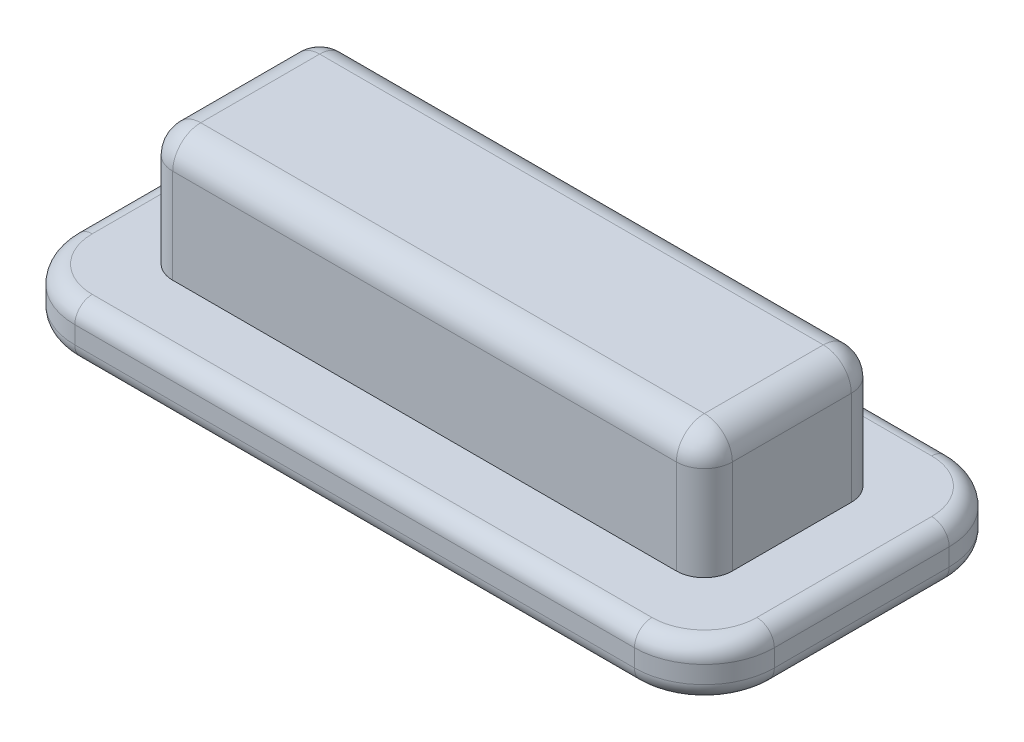
ISO-10303-21;
HEADER;
FILE_DESCRIPTION(('STEP AP214'),'2;1');
FILE_NAME('part.step','',(''),(''),'','','');
FILE_SCHEMA(('AUTOMOTIVE_DESIGN { 1 0 10303 214 1 1 1 1 }'));
ENDSEC;
DATA;
#1=APPLICATION_CONTEXT('core data for automotive mechanical design processes');
#2=APPLICATION_PROTOCOL_DEFINITION('international standard','automotive_design',2000,#1);
#3=PRODUCT_CONTEXT('',#1,'mechanical');
#4=PRODUCT('Part','Part','',(#3));
#5=PRODUCT_RELATED_PRODUCT_CATEGORY('part','',(#4));
#6=PRODUCT_DEFINITION_FORMATION('','',#4);
#7=PRODUCT_DEFINITION_CONTEXT('part definition',#1,'design');
#8=PRODUCT_DEFINITION('design','',#6,#7);
#9=PRODUCT_DEFINITION_SHAPE('','',#8);
#10=(LENGTH_UNIT() NAMED_UNIT(*) SI_UNIT(.MILLI.,.METRE.));
#11=(NAMED_UNIT(*) PLANE_ANGLE_UNIT() SI_UNIT($,.RADIAN.));
#12=(NAMED_UNIT(*) SI_UNIT($,.STERADIAN.) SOLID_ANGLE_UNIT());
#13=UNCERTAINTY_MEASURE_WITH_UNIT(LENGTH_MEASURE(1.E-05),#10,'distance_accuracy_value','');
#14=(GEOMETRIC_REPRESENTATION_CONTEXT(3) GLOBAL_UNCERTAINTY_ASSIGNED_CONTEXT((#13)) GLOBAL_UNIT_ASSIGNED_CONTEXT((#10,
#11,#12)) REPRESENTATION_CONTEXT('',''));
#15=CARTESIAN_POINT('',(0.,0.,0.));
#16=DIRECTION('',(0.,0.,1.));
#17=DIRECTION('',(1.,0.,0.));
#18=AXIS2_PLACEMENT_3D('',#15,#16,#17);
#19=CARTESIAN_POINT('',(0.,1.75,-2.5));
#20=DIRECTION('',(0.,0.,-1.));
#21=DIRECTION('',(-1.,0.,0.));
#22=AXIS2_PLACEMENT_3D('',#19,#20,#21);
#23=PLANE('',#22);
#24=DIRECTION('',(0.,-1.,0.));
#25=VECTOR('',#24,1.);
#26=CARTESIAN_POINT('',(0.4,1.75,-2.5));
#27=LINE('',#26,#25);
#28=CARTESIAN_POINT('',(0.4,0.,-2.5));
#29=VERTEX_POINT('',#28);
#30=CARTESIAN_POINT('',(0.4,1.35,-2.5));
#31=VERTEX_POINT('',#30);
#32=EDGE_CURVE('E257',#29,#31,#27,.F.);
#33=ORIENTED_EDGE('',*,*,#32,.T.);
#34=DIRECTION('',(1.,0.,0.));
#35=VECTOR('',#34,1.);
#36=CARTESIAN_POINT('',(0.,1.35,-2.5));
#37=LINE('',#36,#35);
#38=CARTESIAN_POINT('',(7.6,1.35,-2.5));
#39=VERTEX_POINT('',#38);
#40=EDGE_CURVE('E289',#31,#39,#37,.T.);
#41=ORIENTED_EDGE('',*,*,#40,.T.);
#42=DIRECTION('',(0.,-1.,0.));
#43=VECTOR('',#42,1.);
#44=CARTESIAN_POINT('',(7.6,0.,-2.5));
#45=LINE('',#44,#43);
#46=CARTESIAN_POINT('',(7.6,0.,-2.5));
#47=VERTEX_POINT('',#46);
#48=EDGE_CURVE('E263',#39,#47,#45,.T.);
#49=ORIENTED_EDGE('',*,*,#48,.T.);
#50=DIRECTION('',(1.,0.,0.));
#51=VECTOR('',#50,1.);
#52=CARTESIAN_POINT('',(0.,0.,-2.5));
#53=LINE('',#52,#51);
#54=EDGE_CURVE('E246',#29,#47,#53,.T.);
#55=ORIENTED_EDGE('',*,*,#54,.F.);
#56=EDGE_LOOP('',(#33,#41,#49,#55));
#57=FACE_BOUND('',#56,.T.);
#58=ADVANCED_FACE('F43',(#57),#23,.T.);
#59=CARTESIAN_POINT('',(0.,1.75,0.));
#60=DIRECTION('',(-1.,0.,0.));
#61=DIRECTION('',(0.,0.,1.));
#62=AXIS2_PLACEMENT_3D('',#59,#60,#61);
#63=PLANE('',#62);
#64=DIRECTION('',(0.,-1.,0.));
#65=VECTOR('',#64,1.);
#66=CARTESIAN_POINT('',(0.,1.75,-0.4));
#67=LINE('',#66,#65);
#68=CARTESIAN_POINT('',(0.,0.,-0.4));
#69=VERTEX_POINT('',#68);
#70=CARTESIAN_POINT('',(0.,1.35,-0.4));
#71=VERTEX_POINT('',#70);
#72=EDGE_CURVE('E264',#69,#71,#67,.F.);
#73=ORIENTED_EDGE('',*,*,#72,.T.);
#74=DIRECTION('',(0.,0.,-1.));
#75=VECTOR('',#74,1.);
#76=CARTESIAN_POINT('',(0.,1.35,0.));
#77=LINE('',#76,#75);
#78=CARTESIAN_POINT('',(0.,1.35,-2.1));
#79=VERTEX_POINT('',#78);
#80=EDGE_CURVE('E280',#71,#79,#77,.T.);
#81=ORIENTED_EDGE('',*,*,#80,.T.);
#82=DIRECTION('',(0.,-1.,0.));
#83=VECTOR('',#82,1.);
#84=CARTESIAN_POINT('',(0.,1.75,-2.1));
#85=LINE('',#84,#83);
#86=CARTESIAN_POINT('',(0.,0.,-2.1));
#87=VERTEX_POINT('',#86);
#88=EDGE_CURVE('E245',#79,#87,#85,.T.);
#89=ORIENTED_EDGE('',*,*,#88,.T.);
#90=DIRECTION('',(0.,0.,-1.));
#91=VECTOR('',#90,1.);
#92=CARTESIAN_POINT('',(0.,0.,0.));
#93=LINE('',#92,#91);
#94=EDGE_CURVE('E249',#69,#87,#93,.T.);
#95=ORIENTED_EDGE('',*,*,#94,.F.);
#96=EDGE_LOOP('',(#73,#81,#89,#95));
#97=FACE_BOUND('',#96,.T.);
#98=ADVANCED_FACE('F554',(#97),#63,.T.);
#99=CARTESIAN_POINT('',(0.,1.75,0.));
#100=DIRECTION('',(0.,0.,-1.));
#101=DIRECTION('',(-1.,0.,0.));
#102=AXIS2_PLACEMENT_3D('',#99,#100,#101);
#103=PLANE('',#102);
#104=DIRECTION('',(0.,-1.,0.));
#105=VECTOR('',#104,1.);
#106=CARTESIAN_POINT('',(7.6,1.75,0.));
#107=LINE('',#106,#105);
#108=CARTESIAN_POINT('',(7.6,0.,0.));
#109=VERTEX_POINT('',#108);
#110=CARTESIAN_POINT('',(7.6,1.35,0.));
#111=VERTEX_POINT('',#110);
#112=EDGE_CURVE('E240',#109,#111,#107,.F.);
#113=ORIENTED_EDGE('',*,*,#112,.T.);
#114=DIRECTION('',(1.,0.,0.));
#115=VECTOR('',#114,1.);
#116=CARTESIAN_POINT('',(0.4,1.35,0.));
#117=LINE('',#116,#115);
#118=CARTESIAN_POINT('',(0.4,1.35,0.));
#119=VERTEX_POINT('',#118);
#120=EDGE_CURVE('E300',#111,#119,#117,.F.);
#121=ORIENTED_EDGE('',*,*,#120,.T.);
#122=DIRECTION('',(0.,-1.,0.));
#123=VECTOR('',#122,1.);
#124=CARTESIAN_POINT('',(0.4,0.,0.));
#125=LINE('',#124,#123);
#126=CARTESIAN_POINT('',(0.4,0.,0.));
#127=VERTEX_POINT('',#126);
#128=EDGE_CURVE('E229',#119,#127,#125,.T.);
#129=ORIENTED_EDGE('',*,*,#128,.T.);
#130=DIRECTION('',(1.,0.,0.));
#131=VECTOR('',#130,1.);
#132=CARTESIAN_POINT('',(0.,0.,0.));
#133=LINE('',#132,#131);
#134=EDGE_CURVE('E250',#127,#109,#133,.T.);
#135=ORIENTED_EDGE('',*,*,#134,.T.);
#136=EDGE_LOOP('',(#113,#121,#129,#135));
#137=FACE_BOUND('',#136,.T.);
#138=ADVANCED_FACE('F558',(#137),#103,.F.);
#139=CARTESIAN_POINT('',(8.,1.75,0.));
#140=DIRECTION('',(-1.,0.,0.));
#141=DIRECTION('',(0.,0.,1.));
#142=AXIS2_PLACEMENT_3D('',#139,#140,#141);
#143=PLANE('',#142);
#144=DIRECTION('',(0.,-1.,0.));
#145=VECTOR('',#144,1.);
#146=CARTESIAN_POINT('',(8.,1.75,-2.1));
#147=LINE('',#146,#145);
#148=CARTESIAN_POINT('',(8.,0.,-2.1));
#149=VERTEX_POINT('',#148);
#150=CARTESIAN_POINT('',(8.,1.35,-2.1));
#151=VERTEX_POINT('',#150);
#152=EDGE_CURVE('E233',#149,#151,#147,.F.);
#153=ORIENTED_EDGE('',*,*,#152,.T.);
#154=DIRECTION('',(0.,0.,-1.));
#155=VECTOR('',#154,1.);
#156=CARTESIAN_POINT('',(8.,1.35,-0.4));
#157=LINE('',#156,#155);
#158=CARTESIAN_POINT('',(8.,1.35,-0.4));
#159=VERTEX_POINT('',#158);
#160=EDGE_CURVE('E230',#151,#159,#157,.F.);
#161=ORIENTED_EDGE('',*,*,#160,.T.);
#162=DIRECTION('',(0.,-1.,0.));
#163=VECTOR('',#162,1.);
#164=CARTESIAN_POINT('',(8.,1.75,-0.4));
#165=LINE('',#164,#163);
#166=CARTESIAN_POINT('',(8.,0.,-0.4));
#167=VERTEX_POINT('',#166);
#168=EDGE_CURVE('E218',#159,#167,#165,.T.);
#169=ORIENTED_EDGE('',*,*,#168,.T.);
#170=DIRECTION('',(0.,0.,-1.));
#171=VECTOR('',#170,1.);
#172=CARTESIAN_POINT('',(8.,0.,0.));
#173=LINE('',#172,#171);
#174=EDGE_CURVE('E221',#167,#149,#173,.T.);
#175=ORIENTED_EDGE('',*,*,#174,.T.);
#176=EDGE_LOOP('',(#153,#161,#169,#175));
#177=FACE_BOUND('',#176,.T.);
#178=ADVANCED_FACE('F225',(#177),#143,.F.);
#179=CARTESIAN_POINT('',(0.,1.75,0.));
#180=DIRECTION('',(0.,1.,0.));
#181=DIRECTION('',(0.,0.,1.));
#182=AXIS2_PLACEMENT_3D('',#179,#180,#181);
#183=PLANE('',#182);
#184=DIRECTION('',(1.,0.,0.));
#185=VECTOR('',#184,1.);
#186=CARTESIAN_POINT('',(0.,1.75,-2.1));
#187=LINE('',#186,#185);
#188=CARTESIAN_POINT('',(7.6,1.75,-2.1));
#189=VERTEX_POINT('',#188);
#190=CARTESIAN_POINT('',(0.4,1.75,-2.1));
#191=VERTEX_POINT('',#190);
#192=EDGE_CURVE('E282',#189,#191,#187,.F.);
#193=ORIENTED_EDGE('',*,*,#192,.T.);
#194=DIRECTION('',(0.,0.,-1.));
#195=VECTOR('',#194,1.);
#196=CARTESIAN_POINT('',(0.4,1.75,0.));
#197=LINE('',#196,#195);
#198=CARTESIAN_POINT('',(0.4,1.75,-0.4));
#199=VERTEX_POINT('',#198);
#200=EDGE_CURVE('E284',#191,#199,#197,.F.);
#201=ORIENTED_EDGE('',*,*,#200,.T.);
#202=DIRECTION('',(1.,0.,0.));
#203=VECTOR('',#202,1.);
#204=CARTESIAN_POINT('',(7.6,1.75,-0.4));
#205=LINE('',#204,#203);
#206=CARTESIAN_POINT('',(7.6,1.75,-0.4));
#207=VERTEX_POINT('',#206);
#208=EDGE_CURVE('E276',#199,#207,#205,.T.);
#209=ORIENTED_EDGE('',*,*,#208,.T.);
#210=DIRECTION('',(0.,0.,-1.));
#211=VECTOR('',#210,1.);
#212=CARTESIAN_POINT('',(7.6,1.75,-2.1));
#213=LINE('',#212,#211);
#214=EDGE_CURVE('E281',#207,#189,#213,.T.);
#215=ORIENTED_EDGE('',*,*,#214,.T.);
#216=EDGE_LOOP('',(#193,#201,#209,#215));
#217=FACE_BOUND('',#216,.T.);
#218=ADVANCED_FACE('F854',(#217),#183,.T.);
#219=CARTESIAN_POINT('',(0.,0.,0.));
#220=DIRECTION('',(0.,-1.,0.));
#221=DIRECTION('',(0.,0.,-1.));
#222=AXIS2_PLACEMENT_3D('',#219,#220,#221);
#223=PLANE('',#222);
#224=DIRECTION('',(-1.,0.,0.));
#225=VECTOR('',#224,1.);
#226=CARTESIAN_POINT('',(0.,0.,0.75));
#227=LINE('',#226,#225);
#228=CARTESIAN_POINT('',(0.,0.,0.75));
#229=VERTEX_POINT('',#228);
#230=CARTESIAN_POINT('',(8.,0.,0.75));
#231=VERTEX_POINT('',#230);
#232=EDGE_CURVE('E395',#229,#231,#227,.F.);
#233=ORIENTED_EDGE('',*,*,#232,.T.);
#234=CARTESIAN_POINT('',(8.,0.,0.));
#235=DIRECTION('',(0.,-1.,0.));
#236=DIRECTION('',(0.,0.,-1.));
#237=AXIS2_PLACEMENT_3D('',#234,#235,#236);
#238=CIRCLE('',#237,0.75);
#239=CARTESIAN_POINT('',(8.75,0.,0.));
#240=VERTEX_POINT('',#239);
#241=EDGE_CURVE('E403',#231,#240,#238,.F.);
#242=ORIENTED_EDGE('',*,*,#241,.T.);
#243=DIRECTION('',(0.,0.,1.));
#244=VECTOR('',#243,1.);
#245=CARTESIAN_POINT('',(8.75,0.,0.));
#246=LINE('',#245,#244);
#247=CARTESIAN_POINT('',(8.75,0.,-2.5));
#248=VERTEX_POINT('',#247);
#249=EDGE_CURVE('E70',#240,#248,#246,.F.);
#250=ORIENTED_EDGE('',*,*,#249,.T.);
#251=CARTESIAN_POINT('',(8.,0.,-2.5));
#252=DIRECTION('',(0.,-1.,0.));
#253=DIRECTION('',(0.,0.,-1.));
#254=AXIS2_PLACEMENT_3D('',#251,#252,#253);
#255=CIRCLE('',#254,0.75);
#256=CARTESIAN_POINT('',(8.,0.,-3.25));
#257=VERTEX_POINT('',#256);
#258=EDGE_CURVE('E405',#248,#257,#255,.F.);
#259=ORIENTED_EDGE('',*,*,#258,.T.);
#260=DIRECTION('',(1.,0.,0.));
#261=VECTOR('',#260,1.);
#262=CARTESIAN_POINT('',(0.,0.,-3.25));
#263=LINE('',#262,#261);
#264=CARTESIAN_POINT('',(0.,0.,-3.25));
#265=VERTEX_POINT('',#264);
#266=EDGE_CURVE('E399',#257,#265,#263,.F.);
#267=ORIENTED_EDGE('',*,*,#266,.T.);
#268=CARTESIAN_POINT('',(0.,0.,-2.5));
#269=DIRECTION('',(0.,-1.,0.));
#270=DIRECTION('',(0.,0.,-1.));
#271=AXIS2_PLACEMENT_3D('',#268,#269,#270);
#272=CIRCLE('',#271,0.75);
#273=CARTESIAN_POINT('',(-0.75,0.,-2.5));
#274=VERTEX_POINT('',#273);
#275=EDGE_CURVE('E396',#265,#274,#272,.F.);
#276=ORIENTED_EDGE('',*,*,#275,.T.);
#277=DIRECTION('',(0.,0.,-1.));
#278=VECTOR('',#277,1.);
#279=CARTESIAN_POINT('',(-0.75,0.,0.));
#280=LINE('',#279,#278);
#281=CARTESIAN_POINT('',(-0.75,0.,0.));
#282=VERTEX_POINT('',#281);
#283=EDGE_CURVE('E398',#274,#282,#280,.F.);
#284=ORIENTED_EDGE('',*,*,#283,.T.);
#285=CARTESIAN_POINT('',(0.,0.,0.));
#286=DIRECTION('',(0.,-1.,0.));
#287=DIRECTION('',(0.,0.,-1.));
#288=AXIS2_PLACEMENT_3D('',#285,#286,#287);
#289=CIRCLE('',#288,0.75);
#290=EDGE_CURVE('E393',#282,#229,#289,.F.);
#291=ORIENTED_EDGE('',*,*,#290,.T.);
#292=EDGE_LOOP('',(#233,#242,#250,#259,#267,#276,#284,#291));
#293=FACE_BOUND('',#292,.T.);
#294=ORIENTED_EDGE('',*,*,#134,.F.);
#295=CARTESIAN_POINT('',(0.4,0.,-0.4));
#296=DIRECTION('',(0.,-1.,0.));
#297=DIRECTION('',(0.,0.,-1.));
#298=AXIS2_PLACEMENT_3D('',#295,#296,#297);
#299=CIRCLE('',#298,0.4);
#300=EDGE_CURVE('E275',#127,#69,#299,.T.);
#301=ORIENTED_EDGE('',*,*,#300,.T.);
#302=ORIENTED_EDGE('',*,*,#94,.T.);
#303=CARTESIAN_POINT('',(0.4,0.,-2.1));
#304=DIRECTION('',(0.,-1.,0.));
#305=DIRECTION('',(0.,0.,-1.));
#306=AXIS2_PLACEMENT_3D('',#303,#304,#305);
#307=CIRCLE('',#306,0.4);
#308=EDGE_CURVE('E269',#87,#29,#307,.T.);
#309=ORIENTED_EDGE('',*,*,#308,.T.);
#310=ORIENTED_EDGE('',*,*,#54,.T.);
#311=CARTESIAN_POINT('',(7.6,0.,-2.1));
#312=DIRECTION('',(0.,-1.,0.));
#313=DIRECTION('',(0.,0.,-1.));
#314=AXIS2_PLACEMENT_3D('',#311,#312,#313);
#315=CIRCLE('',#314,0.4);
#316=EDGE_CURVE('E241',#47,#149,#315,.T.);
#317=ORIENTED_EDGE('',*,*,#316,.T.);
#318=ORIENTED_EDGE('',*,*,#174,.F.);
#319=CARTESIAN_POINT('',(7.6,0.,-0.4));
#320=DIRECTION('',(0.,-1.,0.));
#321=DIRECTION('',(0.,0.,-1.));
#322=AXIS2_PLACEMENT_3D('',#319,#320,#321);
#323=CIRCLE('',#322,0.4);
#324=EDGE_CURVE('E232',#167,#109,#323,.T.);
#325=ORIENTED_EDGE('',*,*,#324,.T.);
#326=EDGE_LOOP('',(#294,#301,#302,#309,#310,#317,#318,#325));
#327=FACE_BOUND('',#326,.T.);
#328=ADVANCED_FACE('F243',(#293,#327),#223,.F.);
#329=CARTESIAN_POINT('',(-1.,-0.75,1.));
#330=DIRECTION('',(1.,0.,0.));
#331=DIRECTION('',(0.,0.,-1.));
#332=AXIS2_PLACEMENT_3D('',#329,#330,#331);
#333=PLANE('',#332);
#334=DIRECTION('',(0.,1.,0.));
#335=VECTOR('',#334,1.);
#336=CARTESIAN_POINT('',(-1.,-0.75,-2.5));
#337=LINE('',#336,#335);
#338=CARTESIAN_POINT('',(-1.,-0.25,-2.5));
#339=VERTEX_POINT('',#338);
#340=CARTESIAN_POINT('',(-1.,-0.5,-2.5));
#341=VERTEX_POINT('',#340);
#342=EDGE_CURVE('E336',#339,#341,#337,.F.);
#343=ORIENTED_EDGE('',*,*,#342,.T.);
#344=DIRECTION('',(0.,0.,-1.));
#345=VECTOR('',#344,1.);
#346=CARTESIAN_POINT('',(-1.,-0.5,0.));
#347=LINE('',#346,#345);
#348=CARTESIAN_POINT('',(-1.,-0.5,0.));
#349=VERTEX_POINT('',#348);
#350=EDGE_CURVE('E387',#341,#349,#347,.F.);
#351=ORIENTED_EDGE('',*,*,#350,.T.);
#352=DIRECTION('',(0.,1.,0.));
#353=VECTOR('',#352,1.);
#354=CARTESIAN_POINT('',(-1.,-0.75,0.));
#355=LINE('',#354,#353);
#356=CARTESIAN_POINT('',(-1.,-0.25,0.));
#357=VERTEX_POINT('',#356);
#358=EDGE_CURVE('E334',#349,#357,#355,.T.);
#359=ORIENTED_EDGE('',*,*,#358,.T.);
#360=DIRECTION('',(0.,0.,-1.));
#361=VECTOR('',#360,1.);
#362=CARTESIAN_POINT('',(-1.,-0.25,1.));
#363=LINE('',#362,#361);
#364=EDGE_CURVE('E383',#357,#339,#363,.T.);
#365=ORIENTED_EDGE('',*,*,#364,.T.);
#366=EDGE_LOOP('',(#343,#351,#359,#365));
#367=FACE_BOUND('',#366,.T.);
#368=ADVANCED_FACE('F487',(#367),#333,.F.);
#369=CARTESIAN_POINT('',(-1.,-0.75,-3.5));
#370=DIRECTION('',(0.,0.,1.));
#371=DIRECTION('',(1.,0.,0.));
#372=AXIS2_PLACEMENT_3D('',#369,#370,#371);
#373=PLANE('',#372);
#374=DIRECTION('',(0.,1.,0.));
#375=VECTOR('',#374,1.);
#376=CARTESIAN_POINT('',(8.,-0.75,-3.5));
#377=LINE('',#376,#375);
#378=CARTESIAN_POINT('',(8.,-0.25,-3.5));
#379=VERTEX_POINT('',#378);
#380=CARTESIAN_POINT('',(8.,-0.5,-3.5));
#381=VERTEX_POINT('',#380);
#382=EDGE_CURVE('E329',#379,#381,#377,.F.);
#383=ORIENTED_EDGE('',*,*,#382,.T.);
#384=DIRECTION('',(1.,0.,0.));
#385=VECTOR('',#384,1.);
#386=CARTESIAN_POINT('',(0.,-0.5,-3.5));
#387=LINE('',#386,#385);
#388=CARTESIAN_POINT('',(0.,-0.5,-3.5));
#389=VERTEX_POINT('',#388);
#390=EDGE_CURVE('E378',#381,#389,#387,.F.);
#391=ORIENTED_EDGE('',*,*,#390,.T.);
#392=DIRECTION('',(0.,1.,0.));
#393=VECTOR('',#392,1.);
#394=CARTESIAN_POINT('',(0.,-0.75,-3.5));
#395=LINE('',#394,#393);
#396=CARTESIAN_POINT('',(0.,-0.25,-3.5));
#397=VERTEX_POINT('',#396);
#398=EDGE_CURVE('E330',#389,#397,#395,.T.);
#399=ORIENTED_EDGE('',*,*,#398,.T.);
#400=DIRECTION('',(1.,0.,0.));
#401=VECTOR('',#400,1.);
#402=CARTESIAN_POINT('',(-1.,-0.25,-3.5));
#403=LINE('',#402,#401);
#404=EDGE_CURVE('E376',#397,#379,#403,.T.);
#405=ORIENTED_EDGE('',*,*,#404,.T.);
#406=EDGE_LOOP('',(#383,#391,#399,#405));
#407=FACE_BOUND('',#406,.T.);
#408=ADVANCED_FACE('F464',(#407),#373,.F.);
#409=CARTESIAN_POINT('',(9.,-0.75,-3.5));
#410=DIRECTION('',(-1.,0.,0.));
#411=DIRECTION('',(0.,0.,1.));
#412=AXIS2_PLACEMENT_3D('',#409,#410,#411);
#413=PLANE('',#412);
#414=DIRECTION('',(0.,1.,0.));
#415=VECTOR('',#414,1.);
#416=CARTESIAN_POINT('',(9.,-0.75,0.));
#417=LINE('',#416,#415);
#418=CARTESIAN_POINT('',(9.,-0.25,0.));
#419=VERTEX_POINT('',#418);
#420=CARTESIAN_POINT('',(9.,-0.5,0.));
#421=VERTEX_POINT('',#420);
#422=EDGE_CURVE('E298',#419,#421,#417,.F.);
#423=ORIENTED_EDGE('',*,*,#422,.T.);
#424=DIRECTION('',(0.,0.,1.));
#425=VECTOR('',#424,1.);
#426=CARTESIAN_POINT('',(9.,-0.5,-2.5));
#427=LINE('',#426,#425);
#428=CARTESIAN_POINT('',(9.,-0.5,-2.5));
#429=VERTEX_POINT('',#428);
#430=EDGE_CURVE('E367',#421,#429,#427,.F.);
#431=ORIENTED_EDGE('',*,*,#430,.T.);
#432=DIRECTION('',(0.,1.,0.));
#433=VECTOR('',#432,1.);
#434=CARTESIAN_POINT('',(9.,-0.75,-2.5));
#435=LINE('',#434,#433);
#436=CARTESIAN_POINT('',(9.,-0.25,-2.5));
#437=VERTEX_POINT('',#436);
#438=EDGE_CURVE('E322',#429,#437,#435,.T.);
#439=ORIENTED_EDGE('',*,*,#438,.T.);
#440=DIRECTION('',(0.,0.,1.));
#441=VECTOR('',#440,1.);
#442=CARTESIAN_POINT('',(9.,-0.25,-3.5));
#443=LINE('',#442,#441);
#444=EDGE_CURVE('E366',#437,#419,#443,.T.);
#445=ORIENTED_EDGE('',*,*,#444,.T.);
#446=EDGE_LOOP('',(#423,#431,#439,#445));
#447=FACE_BOUND('',#446,.T.);
#448=ADVANCED_FACE('F521',(#447),#413,.F.);
#449=CARTESIAN_POINT('',(9.,-0.75,1.));
#450=DIRECTION('',(0.,0.,-1.));
#451=DIRECTION('',(-1.,0.,0.));
#452=AXIS2_PLACEMENT_3D('',#449,#450,#451);
#453=PLANE('',#452);
#454=DIRECTION('',(0.,1.,0.));
#455=VECTOR('',#454,1.);
#456=CARTESIAN_POINT('',(0.,-0.75,1.));
#457=LINE('',#456,#455);
#458=CARTESIAN_POINT('',(0.,-0.25,1.));
#459=VERTEX_POINT('',#458);
#460=CARTESIAN_POINT('',(0.,-0.5,1.));
#461=VERTEX_POINT('',#460);
#462=EDGE_CURVE('E345',#459,#461,#457,.F.);
#463=ORIENTED_EDGE('',*,*,#462,.T.);
#464=DIRECTION('',(-1.,0.,0.));
#465=VECTOR('',#464,1.);
#466=CARTESIAN_POINT('',(8.,-0.5,1.));
#467=LINE('',#466,#465);
#468=CARTESIAN_POINT('',(8.,-0.5,1.));
#469=VERTEX_POINT('',#468);
#470=EDGE_CURVE('E11',#461,#469,#467,.F.);
#471=ORIENTED_EDGE('',*,*,#470,.T.);
#472=DIRECTION('',(0.,1.,0.));
#473=VECTOR('',#472,1.);
#474=CARTESIAN_POINT('',(8.,-0.75,1.));
#475=LINE('',#474,#473);
#476=CARTESIAN_POINT('',(8.,-0.25,1.));
#477=VERTEX_POINT('',#476);
#478=EDGE_CURVE('E338',#469,#477,#475,.T.);
#479=ORIENTED_EDGE('',*,*,#478,.T.);
#480=DIRECTION('',(-1.,0.,0.));
#481=VECTOR('',#480,1.);
#482=CARTESIAN_POINT('',(9.,-0.25,1.));
#483=LINE('',#482,#481);
#484=EDGE_CURVE('E55',#477,#459,#483,.T.);
#485=ORIENTED_EDGE('',*,*,#484,.T.);
#486=EDGE_LOOP('',(#463,#471,#479,#485));
#487=FACE_BOUND('',#486,.T.);
#488=ADVANCED_FACE('F509',(#487),#453,.F.);
#489=CARTESIAN_POINT('',(0.,-0.75,0.));
#490=DIRECTION('',(0.,-1.,0.));
#491=DIRECTION('',(0.,0.,-1.));
#492=AXIS2_PLACEMENT_3D('',#489,#490,#491);
#493=PLANE('',#492);
#494=DIRECTION('',(0.,0.,1.));
#495=VECTOR('',#494,1.);
#496=CARTESIAN_POINT('',(8.75,-0.75,0.));
#497=LINE('',#496,#495);
#498=CARTESIAN_POINT('',(8.75,-0.75,-2.5));
#499=VERTEX_POINT('',#498);
#500=CARTESIAN_POINT('',(8.75,-0.75,0.));
#501=VERTEX_POINT('',#500);
#502=EDGE_CURVE('E360',#499,#501,#497,.T.);
#503=ORIENTED_EDGE('',*,*,#502,.T.);
#504=CARTESIAN_POINT('',(8.,-0.75,0.));
#505=DIRECTION('',(0.,-1.,0.));
#506=DIRECTION('',(0.,0.,-1.));
#507=AXIS2_PLACEMENT_3D('',#504,#505,#506);
#508=CIRCLE('',#507,0.75);
#509=CARTESIAN_POINT('',(8.,-0.75,0.75));
#510=VERTEX_POINT('',#509);
#511=EDGE_CURVE('E357',#501,#510,#508,.T.);
#512=ORIENTED_EDGE('',*,*,#511,.T.);
#513=DIRECTION('',(-1.,0.,0.));
#514=VECTOR('',#513,1.);
#515=CARTESIAN_POINT('',(0.,-0.75,0.75));
#516=LINE('',#515,#514);
#517=CARTESIAN_POINT('',(0.,-0.75,0.75));
#518=VERTEX_POINT('',#517);
#519=EDGE_CURVE('E344',#510,#518,#516,.T.);
#520=ORIENTED_EDGE('',*,*,#519,.T.);
#521=CARTESIAN_POINT('',(0.,-0.75,0.));
#522=DIRECTION('',(0.,-1.,0.));
#523=DIRECTION('',(0.,0.,-1.));
#524=AXIS2_PLACEMENT_3D('',#521,#522,#523);
#525=CIRCLE('',#524,0.75);
#526=CARTESIAN_POINT('',(-0.75,-0.75,0.));
#527=VERTEX_POINT('',#526);
#528=EDGE_CURVE('E350',#518,#527,#525,.T.);
#529=ORIENTED_EDGE('',*,*,#528,.T.);
#530=DIRECTION('',(0.,0.,-1.));
#531=VECTOR('',#530,1.);
#532=CARTESIAN_POINT('',(-0.75,-0.75,-2.5));
#533=LINE('',#532,#531);
#534=CARTESIAN_POINT('',(-0.75,-0.75,-2.5));
#535=VERTEX_POINT('',#534);
#536=EDGE_CURVE('E349',#527,#535,#533,.T.);
#537=ORIENTED_EDGE('',*,*,#536,.T.);
#538=CARTESIAN_POINT('',(0.,-0.75,-2.5));
#539=DIRECTION('',(0.,-1.,0.));
#540=DIRECTION('',(0.,0.,-1.));
#541=AXIS2_PLACEMENT_3D('',#538,#539,#540);
#542=CIRCLE('',#541,0.75);
#543=CARTESIAN_POINT('',(0.,-0.75,-3.25));
#544=VERTEX_POINT('',#543);
#545=EDGE_CURVE('E351',#535,#544,#542,.T.);
#546=ORIENTED_EDGE('',*,*,#545,.T.);
#547=DIRECTION('',(1.,0.,0.));
#548=VECTOR('',#547,1.);
#549=CARTESIAN_POINT('',(8.,-0.75,-3.25));
#550=LINE('',#549,#548);
#551=CARTESIAN_POINT('',(8.,-0.75,-3.25));
#552=VERTEX_POINT('',#551);
#553=EDGE_CURVE('E352',#544,#552,#550,.T.);
#554=ORIENTED_EDGE('',*,*,#553,.T.);
#555=CARTESIAN_POINT('',(8.,-0.75,-2.5));
#556=DIRECTION('',(0.,-1.,0.));
#557=DIRECTION('',(0.,0.,-1.));
#558=AXIS2_PLACEMENT_3D('',#555,#556,#557);
#559=CIRCLE('',#558,0.75);
#560=EDGE_CURVE('E354',#552,#499,#559,.T.);
#561=ORIENTED_EDGE('',*,*,#560,.T.);
#562=EDGE_LOOP('',(#503,#512,#520,#529,#537,#546,#554,#561));
#563=FACE_BOUND('',#562,.T.);
#564=ADVANCED_FACE('F477',(#563),#493,.T.);
#565=CARTESIAN_POINT('',(7.6,1.75,-0.4));
#566=DIRECTION('',(0.,-1.,0.));
#567=DIRECTION('',(0.,0.,-1.));
#568=AXIS2_PLACEMENT_3D('',#565,#566,#567);
#569=CYLINDRICAL_SURFACE('',#568,0.4);
#570=ORIENTED_EDGE('',*,*,#168,.F.);
#571=CARTESIAN_POINT('',(7.6,1.35,-0.4));
#572=DIRECTION('',(0.,-1.,0.));
#573=DIRECTION('',(0.,0.,-1.));
#574=AXIS2_PLACEMENT_3D('',#571,#572,#573);
#575=CIRCLE('',#574,0.4);
#576=EDGE_CURVE('E293',#159,#111,#575,.T.);
#577=ORIENTED_EDGE('',*,*,#576,.T.);
#578=ORIENTED_EDGE('',*,*,#112,.F.);
#579=ORIENTED_EDGE('',*,*,#324,.F.);
#580=EDGE_LOOP('',(#570,#577,#578,#579));
#581=FACE_BOUND('',#580,.T.);
#582=ADVANCED_FACE('F234',(#581),#569,.T.);
#583=CARTESIAN_POINT('',(7.6,1.75,-2.1));
#584=DIRECTION('',(0.,1.,0.));
#585=DIRECTION('',(0.,0.,1.));
#586=AXIS2_PLACEMENT_3D('',#583,#584,#585);
#587=CYLINDRICAL_SURFACE('',#586,0.4);
#588=ORIENTED_EDGE('',*,*,#48,.F.);
#589=CARTESIAN_POINT('',(7.6,1.35,-2.1));
#590=DIRECTION('',(0.,1.,0.));
#591=DIRECTION('',(0.,0.,1.));
#592=AXIS2_PLACEMENT_3D('',#589,#590,#591);
#593=CIRCLE('',#592,0.4);
#594=EDGE_CURVE('E295',#39,#151,#593,.F.);
#595=ORIENTED_EDGE('',*,*,#594,.T.);
#596=ORIENTED_EDGE('',*,*,#152,.F.);
#597=ORIENTED_EDGE('',*,*,#316,.F.);
#598=EDGE_LOOP('',(#588,#595,#596,#597));
#599=FACE_BOUND('',#598,.T.);
#600=ADVANCED_FACE('F570',(#599),#587,.T.);
#601=CARTESIAN_POINT('',(0.4,1.75,-2.1));
#602=DIRECTION('',(0.,-1.,0.));
#603=DIRECTION('',(0.,0.,-1.));
#604=AXIS2_PLACEMENT_3D('',#601,#602,#603);
#605=CYLINDRICAL_SURFACE('',#604,0.4);
#606=ORIENTED_EDGE('',*,*,#88,.F.);
#607=CARTESIAN_POINT('',(0.4,1.35,-2.1));
#608=DIRECTION('',(0.,-1.,0.));
#609=DIRECTION('',(0.,0.,-1.));
#610=AXIS2_PLACEMENT_3D('',#607,#608,#609);
#611=CIRCLE('',#610,0.4);
#612=EDGE_CURVE('E286',#79,#31,#611,.T.);
#613=ORIENTED_EDGE('',*,*,#612,.T.);
#614=ORIENTED_EDGE('',*,*,#32,.F.);
#615=ORIENTED_EDGE('',*,*,#308,.F.);
#616=EDGE_LOOP('',(#606,#613,#614,#615));
#617=FACE_BOUND('',#616,.T.);
#618=ADVANCED_FACE('F568',(#617),#605,.T.);
#619=CARTESIAN_POINT('',(0.4,1.75,-0.4));
#620=DIRECTION('',(0.,1.,0.));
#621=DIRECTION('',(0.,0.,1.));
#622=AXIS2_PLACEMENT_3D('',#619,#620,#621);
#623=CYLINDRICAL_SURFACE('',#622,0.4);
#624=ORIENTED_EDGE('',*,*,#128,.F.);
#625=CARTESIAN_POINT('',(0.4,1.35,-0.4));
#626=DIRECTION('',(0.,1.,0.));
#627=DIRECTION('',(0.,0.,1.));
#628=AXIS2_PLACEMENT_3D('',#625,#626,#627);
#629=CIRCLE('',#628,0.4);
#630=EDGE_CURVE('E273',#119,#71,#629,.F.);
#631=ORIENTED_EDGE('',*,*,#630,.T.);
#632=ORIENTED_EDGE('',*,*,#72,.F.);
#633=ORIENTED_EDGE('',*,*,#300,.F.);
#634=EDGE_LOOP('',(#624,#631,#632,#633));
#635=FACE_BOUND('',#634,.T.);
#636=ADVANCED_FACE('F573',(#635),#623,.T.);
#637=CARTESIAN_POINT('',(7.6,1.35,-2.1));
#638=DIRECTION('',(0.,1.,0.));
#639=DIRECTION('',(0.,0.,1.));
#640=AXIS2_PLACEMENT_3D('',#637,#638,#639);
#641=SPHERICAL_SURFACE('',#640,0.4);
#642=CARTESIAN_POINT('',(7.6,1.35,-2.1));
#643=DIRECTION('',(0.,0.,1.));
#644=DIRECTION('',(1.,0.,0.));
#645=AXIS2_PLACEMENT_3D('',#642,#643,#644);
#646=CIRCLE('',#645,0.4);
#647=EDGE_CURVE('E320',#151,#189,#646,.T.);
#648=ORIENTED_EDGE('',*,*,#647,.F.);
#649=ORIENTED_EDGE('',*,*,#594,.F.);
#650=CARTESIAN_POINT('',(7.6,1.35,-2.1));
#651=DIRECTION('',(-1.,0.,0.));
#652=DIRECTION('',(0.,0.,1.));
#653=AXIS2_PLACEMENT_3D('',#650,#651,#652);
#654=CIRCLE('',#653,0.4);
#655=EDGE_CURVE('E252',#189,#39,#654,.T.);
#656=ORIENTED_EDGE('',*,*,#655,.F.);
#657=EDGE_LOOP('',(#648,#649,#656));
#658=FACE_BOUND('',#657,.T.);
#659=ADVANCED_FACE('F576',(#658),#641,.T.);
#660=CARTESIAN_POINT('',(0.,1.35,-2.1));
#661=DIRECTION('',(1.,0.,0.));
#662=DIRECTION('',(0.,0.,-1.));
#663=AXIS2_PLACEMENT_3D('',#660,#661,#662);
#664=CYLINDRICAL_SURFACE('',#663,0.4);
#665=ORIENTED_EDGE('',*,*,#655,.T.);
#666=ORIENTED_EDGE('',*,*,#40,.F.);
#667=CARTESIAN_POINT('',(0.4,1.35,-2.1));
#668=DIRECTION('',(-1.,0.,0.));
#669=DIRECTION('',(0.,0.,1.));
#670=AXIS2_PLACEMENT_3D('',#667,#668,#669);
#671=CIRCLE('',#670,0.4);
#672=EDGE_CURVE('E314',#191,#31,#671,.T.);
#673=ORIENTED_EDGE('',*,*,#672,.F.);
#674=ORIENTED_EDGE('',*,*,#192,.F.);
#675=EDGE_LOOP('',(#665,#666,#673,#674));
#676=FACE_BOUND('',#675,.T.);
#677=ADVANCED_FACE('F602',(#676),#664,.T.);
#678=CARTESIAN_POINT('',(7.6,1.35,0.));
#679=DIRECTION('',(0.,0.,1.));
#680=DIRECTION('',(1.,0.,0.));
#681=AXIS2_PLACEMENT_3D('',#678,#679,#680);
#682=CYLINDRICAL_SURFACE('',#681,0.4);
#683=ORIENTED_EDGE('',*,*,#647,.T.);
#684=ORIENTED_EDGE('',*,*,#214,.F.);
#685=CARTESIAN_POINT('',(7.6,1.35,-0.4));
#686=DIRECTION('',(0.,0.,1.));
#687=DIRECTION('',(1.,0.,0.));
#688=AXIS2_PLACEMENT_3D('',#685,#686,#687);
#689=CIRCLE('',#688,0.4);
#690=EDGE_CURVE('E313',#159,#207,#689,.T.);
#691=ORIENTED_EDGE('',*,*,#690,.F.);
#692=ORIENTED_EDGE('',*,*,#160,.F.);
#693=EDGE_LOOP('',(#683,#684,#691,#692));
#694=FACE_BOUND('',#693,.T.);
#695=ADVANCED_FACE('F597',(#694),#682,.T.);
#696=CARTESIAN_POINT('',(0.4,1.35,-2.1));
#697=DIRECTION('',(0.,1.,0.));
#698=DIRECTION('',(0.,0.,1.));
#699=AXIS2_PLACEMENT_3D('',#696,#697,#698);
#700=SPHERICAL_SURFACE('',#699,0.4);
#701=ORIENTED_EDGE('',*,*,#672,.T.);
#702=ORIENTED_EDGE('',*,*,#612,.F.);
#703=CARTESIAN_POINT('',(0.4,1.35,-2.1));
#704=DIRECTION('',(0.,0.,1.));
#705=DIRECTION('',(1.,0.,0.));
#706=AXIS2_PLACEMENT_3D('',#703,#704,#705);
#707=CIRCLE('',#706,0.4);
#708=EDGE_CURVE('E306',#191,#79,#707,.T.);
#709=ORIENTED_EDGE('',*,*,#708,.F.);
#710=EDGE_LOOP('',(#701,#702,#709));
#711=FACE_BOUND('',#710,.T.);
#712=ADVANCED_FACE('F594',(#711),#700,.T.);
#713=CARTESIAN_POINT('',(7.6,1.35,-0.4));
#714=DIRECTION('',(0.,1.,0.));
#715=DIRECTION('',(0.,0.,1.));
#716=AXIS2_PLACEMENT_3D('',#713,#714,#715);
#717=SPHERICAL_SURFACE('',#716,0.4);
#718=ORIENTED_EDGE('',*,*,#576,.F.);
#719=ORIENTED_EDGE('',*,*,#690,.T.);
#720=CARTESIAN_POINT('',(7.6,1.35,-0.4));
#721=DIRECTION('',(-1.,0.,0.));
#722=DIRECTION('',(0.,0.,1.));
#723=AXIS2_PLACEMENT_3D('',#720,#721,#722);
#724=CIRCLE('',#723,0.4);
#725=EDGE_CURVE('E304',#111,#207,#724,.T.);
#726=ORIENTED_EDGE('',*,*,#725,.F.);
#727=EDGE_LOOP('',(#718,#719,#726));
#728=FACE_BOUND('',#727,.T.);
#729=ADVANCED_FACE('F591',(#728),#717,.T.);
#730=CARTESIAN_POINT('',(0.4,1.35,0.));
#731=DIRECTION('',(0.,0.,-1.));
#732=DIRECTION('',(-1.,0.,0.));
#733=AXIS2_PLACEMENT_3D('',#730,#731,#732);
#734=CYLINDRICAL_SURFACE('',#733,0.4);
#735=ORIENTED_EDGE('',*,*,#708,.T.);
#736=ORIENTED_EDGE('',*,*,#80,.F.);
#737=CARTESIAN_POINT('',(0.4,1.35,-0.4));
#738=DIRECTION('',(0.,0.,1.));
#739=DIRECTION('',(1.,0.,0.));
#740=AXIS2_PLACEMENT_3D('',#737,#738,#739);
#741=CIRCLE('',#740,0.4);
#742=EDGE_CURVE('E305',#199,#71,#741,.T.);
#743=ORIENTED_EDGE('',*,*,#742,.F.);
#744=ORIENTED_EDGE('',*,*,#200,.F.);
#745=EDGE_LOOP('',(#735,#736,#743,#744));
#746=FACE_BOUND('',#745,.T.);
#747=ADVANCED_FACE('F590',(#746),#734,.T.);
#748=CARTESIAN_POINT('',(0.,1.35,-0.4));
#749=DIRECTION('',(-1.,0.,0.));
#750=DIRECTION('',(0.,0.,1.));
#751=AXIS2_PLACEMENT_3D('',#748,#749,#750);
#752=CYLINDRICAL_SURFACE('',#751,0.4);
#753=ORIENTED_EDGE('',*,*,#725,.T.);
#754=ORIENTED_EDGE('',*,*,#208,.F.);
#755=CARTESIAN_POINT('',(0.4,1.35,-0.4));
#756=DIRECTION('',(-1.,0.,0.));
#757=DIRECTION('',(0.,0.,1.));
#758=AXIS2_PLACEMENT_3D('',#755,#756,#757);
#759=CIRCLE('',#758,0.4);
#760=EDGE_CURVE('E299',#119,#199,#759,.T.);
#761=ORIENTED_EDGE('',*,*,#760,.F.);
#762=ORIENTED_EDGE('',*,*,#120,.F.);
#763=EDGE_LOOP('',(#753,#754,#761,#762));
#764=FACE_BOUND('',#763,.T.);
#765=ADVANCED_FACE('F581',(#764),#752,.T.);
#766=CARTESIAN_POINT('',(0.4,1.35,-0.4));
#767=DIRECTION('',(0.,1.,0.));
#768=DIRECTION('',(0.,0.,1.));
#769=AXIS2_PLACEMENT_3D('',#766,#767,#768);
#770=SPHERICAL_SURFACE('',#769,0.4);
#771=ORIENTED_EDGE('',*,*,#742,.T.);
#772=ORIENTED_EDGE('',*,*,#630,.F.);
#773=ORIENTED_EDGE('',*,*,#760,.T.);
#774=EDGE_LOOP('',(#771,#772,#773));
#775=FACE_BOUND('',#774,.T.);
#776=ADVANCED_FACE('F579',(#775),#770,.T.);
#777=CARTESIAN_POINT('',(8.,-0.75,-2.5));
#778=DIRECTION('',(0.,1.,0.));
#779=DIRECTION('',(0.,0.,1.));
#780=AXIS2_PLACEMENT_3D('',#777,#778,#779);
#781=CYLINDRICAL_SURFACE('',#780,1.);
#782=ORIENTED_EDGE('',*,*,#438,.F.);
#783=CARTESIAN_POINT('',(8.,-0.5,-2.5));
#784=DIRECTION('',(0.,-1.,0.));
#785=DIRECTION('',(0.,0.,-1.));
#786=AXIS2_PLACEMENT_3D('',#783,#784,#785);
#787=CIRCLE('',#786,1.);
#788=EDGE_CURVE('E372',#429,#381,#787,.F.);
#789=ORIENTED_EDGE('',*,*,#788,.T.);
#790=ORIENTED_EDGE('',*,*,#382,.F.);
#791=CARTESIAN_POINT('',(8.,-0.25,-2.5));
#792=DIRECTION('',(0.,-1.,0.));
#793=DIRECTION('',(0.,0.,-1.));
#794=AXIS2_PLACEMENT_3D('',#791,#792,#793);
#795=CIRCLE('',#794,1.);
#796=EDGE_CURVE('E375',#379,#437,#795,.T.);
#797=ORIENTED_EDGE('',*,*,#796,.T.);
#798=EDGE_LOOP('',(#782,#789,#790,#797));
#799=FACE_BOUND('',#798,.T.);
#800=ADVANCED_FACE('F528',(#799),#781,.T.);
#801=CARTESIAN_POINT('',(0.,-0.75,-2.5));
#802=DIRECTION('',(0.,1.,0.));
#803=DIRECTION('',(0.,0.,1.));
#804=AXIS2_PLACEMENT_3D('',#801,#802,#803);
#805=CYLINDRICAL_SURFACE('',#804,1.);
#806=ORIENTED_EDGE('',*,*,#398,.F.);
#807=CARTESIAN_POINT('',(0.,-0.5,-2.5));
#808=DIRECTION('',(0.,-1.,0.));
#809=DIRECTION('',(0.,0.,-1.));
#810=AXIS2_PLACEMENT_3D('',#807,#808,#809);
#811=CIRCLE('',#810,1.);
#812=EDGE_CURVE('E385',#389,#341,#811,.F.);
#813=ORIENTED_EDGE('',*,*,#812,.T.);
#814=ORIENTED_EDGE('',*,*,#342,.F.);
#815=CARTESIAN_POINT('',(0.,-0.25,-2.5));
#816=DIRECTION('',(0.,-1.,0.));
#817=DIRECTION('',(0.,0.,-1.));
#818=AXIS2_PLACEMENT_3D('',#815,#816,#817);
#819=CIRCLE('',#818,1.);
#820=EDGE_CURVE('E379',#339,#397,#819,.T.);
#821=ORIENTED_EDGE('',*,*,#820,.T.);
#822=EDGE_LOOP('',(#806,#813,#814,#821));
#823=FACE_BOUND('',#822,.T.);
#824=ADVANCED_FACE('F465',(#823),#805,.T.);
#825=CARTESIAN_POINT('',(0.,-0.75,0.));
#826=DIRECTION('',(0.,1.,0.));
#827=DIRECTION('',(0.,0.,1.));
#828=AXIS2_PLACEMENT_3D('',#825,#826,#827);
#829=CYLINDRICAL_SURFACE('',#828,1.);
#830=ORIENTED_EDGE('',*,*,#358,.F.);
#831=CARTESIAN_POINT('',(0.,-0.5,0.));
#832=DIRECTION('',(0.,-1.,0.));
#833=DIRECTION('',(0.,0.,-1.));
#834=AXIS2_PLACEMENT_3D('',#831,#832,#833);
#835=CIRCLE('',#834,1.);
#836=EDGE_CURVE('E388',#349,#461,#835,.F.);
#837=ORIENTED_EDGE('',*,*,#836,.T.);
#838=ORIENTED_EDGE('',*,*,#462,.F.);
#839=CARTESIAN_POINT('',(0.,-0.25,0.));
#840=DIRECTION('',(0.,-1.,0.));
#841=DIRECTION('',(0.,0.,-1.));
#842=AXIS2_PLACEMENT_3D('',#839,#840,#841);
#843=CIRCLE('',#842,1.);
#844=EDGE_CURVE('E389',#459,#357,#843,.T.);
#845=ORIENTED_EDGE('',*,*,#844,.T.);
#846=EDGE_LOOP('',(#830,#837,#838,#845));
#847=FACE_BOUND('',#846,.T.);
#848=ADVANCED_FACE('F492',(#847),#829,.T.);
#849=CARTESIAN_POINT('',(8.,-0.75,0.));
#850=DIRECTION('',(0.,1.,0.));
#851=DIRECTION('',(0.,0.,1.));
#852=AXIS2_PLACEMENT_3D('',#849,#850,#851);
#853=CYLINDRICAL_SURFACE('',#852,1.);
#854=ORIENTED_EDGE('',*,*,#478,.F.);
#855=CARTESIAN_POINT('',(8.,-0.5,0.));
#856=DIRECTION('',(0.,-1.,0.));
#857=DIRECTION('',(0.,0.,-1.));
#858=AXIS2_PLACEMENT_3D('',#855,#856,#857);
#859=CIRCLE('',#858,1.);
#860=EDGE_CURVE('E364',#469,#421,#859,.F.);
#861=ORIENTED_EDGE('',*,*,#860,.T.);
#862=ORIENTED_EDGE('',*,*,#422,.F.);
#863=CARTESIAN_POINT('',(8.,-0.25,0.));
#864=DIRECTION('',(0.,-1.,0.));
#865=DIRECTION('',(0.,0.,-1.));
#866=AXIS2_PLACEMENT_3D('',#863,#864,#865);
#867=CIRCLE('',#866,1.);
#868=EDGE_CURVE('E362',#419,#477,#867,.T.);
#869=ORIENTED_EDGE('',*,*,#868,.T.);
#870=EDGE_LOOP('',(#854,#861,#862,#869));
#871=FACE_BOUND('',#870,.T.);
#872=ADVANCED_FACE('F511',(#871),#853,.T.);
#873=CARTESIAN_POINT('',(0.,-0.5,-2.5));
#874=DIRECTION('',(0.,-1.,0.));
#875=DIRECTION('',(0.,0.,-1.));
#876=AXIS2_PLACEMENT_3D('',#873,#874,#875);
#877=TOROIDAL_SURFACE('',#876,0.75,0.25);
#878=CARTESIAN_POINT('',(-0.75,-0.5,-2.5));
#879=DIRECTION('',(0.,0.,1.));
#880=DIRECTION('',(1.,0.,0.));
#881=AXIS2_PLACEMENT_3D('',#878,#879,#880);
#882=CIRCLE('',#881,0.25);
#883=EDGE_CURVE('E424',#341,#535,#882,.T.);
#884=ORIENTED_EDGE('',*,*,#883,.F.);
#885=ORIENTED_EDGE('',*,*,#812,.F.);
#886=CARTESIAN_POINT('',(0.,-0.5,-3.25));
#887=DIRECTION('',(1.,0.,0.));
#888=DIRECTION('',(0.,0.,-1.));
#889=AXIS2_PLACEMENT_3D('',#886,#887,#888);
#890=CIRCLE('',#889,0.25);
#891=EDGE_CURVE('E301',#544,#389,#890,.T.);
#892=ORIENTED_EDGE('',*,*,#891,.F.);
#893=ORIENTED_EDGE('',*,*,#545,.F.);
#894=EDGE_LOOP('',(#884,#885,#892,#893));
#895=FACE_BOUND('',#894,.T.);
#896=ADVANCED_FACE('F486',(#895),#877,.T.);
#897=CARTESIAN_POINT('',(0.,-0.5,-3.25));
#898=DIRECTION('',(-1.,0.,0.));
#899=DIRECTION('',(0.,0.,1.));
#900=AXIS2_PLACEMENT_3D('',#897,#898,#899);
#901=CYLINDRICAL_SURFACE('',#900,0.25);
#902=ORIENTED_EDGE('',*,*,#891,.T.);
#903=ORIENTED_EDGE('',*,*,#390,.F.);
#904=CARTESIAN_POINT('',(8.,-0.5,-3.25));
#905=DIRECTION('',(1.,0.,0.));
#906=DIRECTION('',(0.,0.,-1.));
#907=AXIS2_PLACEMENT_3D('',#904,#905,#906);
#908=CIRCLE('',#907,0.25);
#909=EDGE_CURVE('E423',#552,#381,#908,.T.);
#910=ORIENTED_EDGE('',*,*,#909,.F.);
#911=ORIENTED_EDGE('',*,*,#553,.F.);
#912=EDGE_LOOP('',(#902,#903,#910,#911));
#913=FACE_BOUND('',#912,.T.);
#914=ADVANCED_FACE('F469',(#913),#901,.T.);
#915=CARTESIAN_POINT('',(-0.75,-0.5,0.));
#916=DIRECTION('',(0.,0.,1.));
#917=DIRECTION('',(1.,0.,0.));
#918=AXIS2_PLACEMENT_3D('',#915,#916,#917);
#919=CYLINDRICAL_SURFACE('',#918,0.25);
#920=ORIENTED_EDGE('',*,*,#883,.T.);
#921=ORIENTED_EDGE('',*,*,#536,.F.);
#922=CARTESIAN_POINT('',(-0.75,-0.5,0.));
#923=DIRECTION('',(0.,0.,1.));
#924=DIRECTION('',(1.,0.,0.));
#925=AXIS2_PLACEMENT_3D('',#922,#923,#924);
#926=CIRCLE('',#925,0.25);
#927=EDGE_CURVE('E416',#349,#527,#926,.T.);
#928=ORIENTED_EDGE('',*,*,#927,.F.);
#929=ORIENTED_EDGE('',*,*,#350,.F.);
#930=EDGE_LOOP('',(#920,#921,#928,#929));
#931=FACE_BOUND('',#930,.T.);
#932=ADVANCED_FACE('F499',(#931),#919,.T.);
#933=CARTESIAN_POINT('',(8.,-0.5,-2.5));
#934=DIRECTION('',(0.,-1.,0.));
#935=DIRECTION('',(0.,0.,-1.));
#936=AXIS2_PLACEMENT_3D('',#933,#934,#935);
#937=TOROIDAL_SURFACE('',#936,0.75,0.25);
#938=ORIENTED_EDGE('',*,*,#909,.T.);
#939=ORIENTED_EDGE('',*,*,#788,.F.);
#940=CARTESIAN_POINT('',(8.75,-0.5,-2.5));
#941=DIRECTION('',(0.,0.,1.));
#942=DIRECTION('',(1.,0.,0.));
#943=AXIS2_PLACEMENT_3D('',#940,#941,#942);
#944=CIRCLE('',#943,0.25);
#945=EDGE_CURVE('E414',#499,#429,#944,.T.);
#946=ORIENTED_EDGE('',*,*,#945,.F.);
#947=ORIENTED_EDGE('',*,*,#560,.F.);
#948=EDGE_LOOP('',(#938,#939,#946,#947));
#949=FACE_BOUND('',#948,.T.);
#950=ADVANCED_FACE('F478',(#949),#937,.T.);
#951=CARTESIAN_POINT('',(0.,-0.5,0.));
#952=DIRECTION('',(0.,-1.,0.));
#953=DIRECTION('',(0.,0.,-1.));
#954=AXIS2_PLACEMENT_3D('',#951,#952,#953);
#955=TOROIDAL_SURFACE('',#954,0.75,0.25);
#956=ORIENTED_EDGE('',*,*,#927,.T.);
#957=ORIENTED_EDGE('',*,*,#528,.F.);
#958=CARTESIAN_POINT('',(0.,-0.5,0.75));
#959=DIRECTION('',(1.,0.,0.));
#960=DIRECTION('',(0.,0.,-1.));
#961=AXIS2_PLACEMENT_3D('',#958,#959,#960);
#962=CIRCLE('',#961,0.25);
#963=EDGE_CURVE('E415',#461,#518,#962,.T.);
#964=ORIENTED_EDGE('',*,*,#963,.F.);
#965=ORIENTED_EDGE('',*,*,#836,.F.);
#966=EDGE_LOOP('',(#956,#957,#964,#965));
#967=FACE_BOUND('',#966,.T.);
#968=ADVANCED_FACE('F505',(#967),#955,.T.);
#969=CARTESIAN_POINT('',(8.75,-0.5,0.));
#970=DIRECTION('',(0.,0.,-1.));
#971=DIRECTION('',(-1.,0.,0.));
#972=AXIS2_PLACEMENT_3D('',#969,#970,#971);
#973=CYLINDRICAL_SURFACE('',#972,0.25);
#974=ORIENTED_EDGE('',*,*,#945,.T.);
#975=ORIENTED_EDGE('',*,*,#430,.F.);
#976=CARTESIAN_POINT('',(8.75,-0.5,0.));
#977=DIRECTION('',(0.,0.,1.));
#978=DIRECTION('',(1.,0.,0.));
#979=AXIS2_PLACEMENT_3D('',#976,#977,#978);
#980=CIRCLE('',#979,0.25);
#981=EDGE_CURVE('E409',#501,#421,#980,.T.);
#982=ORIENTED_EDGE('',*,*,#981,.F.);
#983=ORIENTED_EDGE('',*,*,#502,.F.);
#984=EDGE_LOOP('',(#974,#975,#982,#983));
#985=FACE_BOUND('',#984,.T.);
#986=ADVANCED_FACE('F519',(#985),#973,.T.);
#987=CARTESIAN_POINT('',(0.,-0.5,0.75));
#988=DIRECTION('',(1.,0.,0.));
#989=DIRECTION('',(0.,0.,-1.));
#990=AXIS2_PLACEMENT_3D('',#987,#988,#989);
#991=CYLINDRICAL_SURFACE('',#990,0.25);
#992=ORIENTED_EDGE('',*,*,#963,.T.);
#993=ORIENTED_EDGE('',*,*,#519,.F.);
#994=CARTESIAN_POINT('',(8.,-0.5,0.75));
#995=DIRECTION('',(1.,0.,0.));
#996=DIRECTION('',(0.,0.,-1.));
#997=AXIS2_PLACEMENT_3D('',#994,#995,#996);
#998=CIRCLE('',#997,0.25);
#999=EDGE_CURVE('E407',#469,#510,#998,.T.);
#1000=ORIENTED_EDGE('',*,*,#999,.F.);
#1001=ORIENTED_EDGE('',*,*,#470,.F.);
#1002=EDGE_LOOP('',(#992,#993,#1000,#1001));
#1003=FACE_BOUND('',#1002,.T.);
#1004=ADVANCED_FACE('F510',(#1003),#991,.T.);
#1005=CARTESIAN_POINT('',(8.,-0.5,0.));
#1006=DIRECTION('',(0.,-1.,0.));
#1007=DIRECTION('',(0.,0.,-1.));
#1008=AXIS2_PLACEMENT_3D('',#1005,#1006,#1007);
#1009=TOROIDAL_SURFACE('',#1008,0.75,0.25);
#1010=ORIENTED_EDGE('',*,*,#981,.T.);
#1011=ORIENTED_EDGE('',*,*,#860,.F.);
#1012=ORIENTED_EDGE('',*,*,#999,.T.);
#1013=ORIENTED_EDGE('',*,*,#511,.F.);
#1014=EDGE_LOOP('',(#1010,#1011,#1012,#1013));
#1015=FACE_BOUND('',#1014,.T.);
#1016=ADVANCED_FACE('F516',(#1015),#1009,.T.);
#1017=CARTESIAN_POINT('',(0.,-0.25,-2.5));
#1018=DIRECTION('',(0.,-1.,0.));
#1019=DIRECTION('',(0.,0.,-1.));
#1020=AXIS2_PLACEMENT_3D('',#1017,#1018,#1019);
#1021=TOROIDAL_SURFACE('',#1020,0.75,0.25);
#1022=CARTESIAN_POINT('',(0.,-0.25,-3.25));
#1023=DIRECTION('',(1.,0.,0.));
#1024=DIRECTION('',(0.,0.,-1.));
#1025=AXIS2_PLACEMENT_3D('',#1022,#1023,#1024);
#1026=CIRCLE('',#1025,0.25);
#1027=EDGE_CURVE('E444',#397,#265,#1026,.T.);
#1028=ORIENTED_EDGE('',*,*,#1027,.F.);
#1029=ORIENTED_EDGE('',*,*,#820,.F.);
#1030=CARTESIAN_POINT('',(-0.75,-0.25,-2.5));
#1031=DIRECTION('',(0.,0.,1.));
#1032=DIRECTION('',(1.,0.,0.));
#1033=AXIS2_PLACEMENT_3D('',#1030,#1031,#1032);
#1034=CIRCLE('',#1033,0.25);
#1035=EDGE_CURVE('E50',#274,#339,#1034,.T.);
#1036=ORIENTED_EDGE('',*,*,#1035,.F.);
#1037=ORIENTED_EDGE('',*,*,#275,.F.);
#1038=EDGE_LOOP('',(#1028,#1029,#1036,#1037));
#1039=FACE_BOUND('',#1038,.T.);
#1040=ADVANCED_FACE('F44',(#1039),#1021,.T.);
#1041=CARTESIAN_POINT('',(-0.75,-0.25,1.));
#1042=DIRECTION('',(0.,0.,-1.));
#1043=DIRECTION('',(-1.,0.,0.));
#1044=AXIS2_PLACEMENT_3D('',#1041,#1042,#1043);
#1045=CYLINDRICAL_SURFACE('',#1044,0.25);
#1046=ORIENTED_EDGE('',*,*,#1035,.T.);
#1047=ORIENTED_EDGE('',*,*,#364,.F.);
#1048=CARTESIAN_POINT('',(-0.75,-0.25,0.));
#1049=DIRECTION('',(0.,0.,1.));
#1050=DIRECTION('',(1.,0.,0.));
#1051=AXIS2_PLACEMENT_3D('',#1048,#1049,#1050);
#1052=CIRCLE('',#1051,0.25);
#1053=EDGE_CURVE('E442',#282,#357,#1052,.T.);
#1054=ORIENTED_EDGE('',*,*,#1053,.F.);
#1055=ORIENTED_EDGE('',*,*,#283,.F.);
#1056=EDGE_LOOP('',(#1046,#1047,#1054,#1055));
#1057=FACE_BOUND('',#1056,.T.);
#1058=ADVANCED_FACE('F452',(#1057),#1045,.T.);
#1059=CARTESIAN_POINT('',(-1.,-0.25,-3.25));
#1060=DIRECTION('',(1.,0.,0.));
#1061=DIRECTION('',(0.,0.,-1.));
#1062=AXIS2_PLACEMENT_3D('',#1059,#1060,#1061);
#1063=CYLINDRICAL_SURFACE('',#1062,0.25);
#1064=ORIENTED_EDGE('',*,*,#1027,.T.);
#1065=ORIENTED_EDGE('',*,*,#266,.F.);
#1066=CARTESIAN_POINT('',(8.,-0.25,-3.25));
#1067=DIRECTION('',(1.,0.,0.));
#1068=DIRECTION('',(0.,0.,-1.));
#1069=AXIS2_PLACEMENT_3D('',#1066,#1067,#1068);
#1070=CIRCLE('',#1069,0.25);
#1071=EDGE_CURVE('E437',#379,#257,#1070,.T.);
#1072=ORIENTED_EDGE('',*,*,#1071,.F.);
#1073=ORIENTED_EDGE('',*,*,#404,.F.);
#1074=EDGE_LOOP('',(#1064,#1065,#1072,#1073));
#1075=FACE_BOUND('',#1074,.T.);
#1076=ADVANCED_FACE('F542',(#1075),#1063,.T.);
#1077=CARTESIAN_POINT('',(0.,-0.25,0.));
#1078=DIRECTION('',(0.,-1.,0.));
#1079=DIRECTION('',(0.,0.,-1.));
#1080=AXIS2_PLACEMENT_3D('',#1077,#1078,#1079);
#1081=TOROIDAL_SURFACE('',#1080,0.75,0.25);
#1082=ORIENTED_EDGE('',*,*,#1053,.T.);
#1083=ORIENTED_EDGE('',*,*,#844,.F.);
#1084=CARTESIAN_POINT('',(0.,-0.25,0.75));
#1085=DIRECTION('',(1.,0.,0.));
#1086=DIRECTION('',(0.,0.,-1.));
#1087=AXIS2_PLACEMENT_3D('',#1084,#1085,#1086);
#1088=CIRCLE('',#1087,0.25);
#1089=EDGE_CURVE('E434',#229,#459,#1088,.T.);
#1090=ORIENTED_EDGE('',*,*,#1089,.F.);
#1091=ORIENTED_EDGE('',*,*,#290,.F.);
#1092=EDGE_LOOP('',(#1082,#1083,#1090,#1091));
#1093=FACE_BOUND('',#1092,.T.);
#1094=ADVANCED_FACE('F545',(#1093),#1081,.T.);
#1095=CARTESIAN_POINT('',(8.,-0.25,-2.5));
#1096=DIRECTION('',(0.,-1.,0.));
#1097=DIRECTION('',(0.,0.,-1.));
#1098=AXIS2_PLACEMENT_3D('',#1095,#1096,#1097);
#1099=TOROIDAL_SURFACE('',#1098,0.75,0.25);
#1100=ORIENTED_EDGE('',*,*,#1071,.T.);
#1101=ORIENTED_EDGE('',*,*,#258,.F.);
#1102=CARTESIAN_POINT('',(8.75,-0.25,-2.5));
#1103=DIRECTION('',(0.,0.,1.));
#1104=DIRECTION('',(1.,0.,0.));
#1105=AXIS2_PLACEMENT_3D('',#1102,#1103,#1104);
#1106=CIRCLE('',#1105,0.25);
#1107=EDGE_CURVE('E435',#437,#248,#1106,.T.);
#1108=ORIENTED_EDGE('',*,*,#1107,.F.);
#1109=ORIENTED_EDGE('',*,*,#796,.F.);
#1110=EDGE_LOOP('',(#1100,#1101,#1108,#1109));
#1111=FACE_BOUND('',#1110,.T.);
#1112=ADVANCED_FACE('F529',(#1111),#1099,.T.);
#1113=CARTESIAN_POINT('',(9.,-0.25,0.75));
#1114=DIRECTION('',(-1.,0.,0.));
#1115=DIRECTION('',(0.,0.,1.));
#1116=AXIS2_PLACEMENT_3D('',#1113,#1114,#1115);
#1117=CYLINDRICAL_SURFACE('',#1116,0.25);
#1118=ORIENTED_EDGE('',*,*,#1089,.T.);
#1119=ORIENTED_EDGE('',*,*,#484,.F.);
#1120=CARTESIAN_POINT('',(8.,-0.25,0.75));
#1121=DIRECTION('',(1.,0.,0.));
#1122=DIRECTION('',(0.,0.,-1.));
#1123=AXIS2_PLACEMENT_3D('',#1120,#1121,#1122);
#1124=CIRCLE('',#1123,0.25);
#1125=EDGE_CURVE('E429',#231,#477,#1124,.T.);
#1126=ORIENTED_EDGE('',*,*,#1125,.F.);
#1127=ORIENTED_EDGE('',*,*,#232,.F.);
#1128=EDGE_LOOP('',(#1118,#1119,#1126,#1127));
#1129=FACE_BOUND('',#1128,.T.);
#1130=ADVANCED_FACE('F537',(#1129),#1117,.T.);
#1131=CARTESIAN_POINT('',(8.75,-0.25,-3.5));
#1132=DIRECTION('',(0.,0.,1.));
#1133=DIRECTION('',(1.,0.,0.));
#1134=AXIS2_PLACEMENT_3D('',#1131,#1132,#1133);
#1135=CYLINDRICAL_SURFACE('',#1134,0.25);
#1136=ORIENTED_EDGE('',*,*,#1107,.T.);
#1137=ORIENTED_EDGE('',*,*,#249,.F.);
#1138=CARTESIAN_POINT('',(8.75,-0.25,0.));
#1139=DIRECTION('',(0.,0.,1.));
#1140=DIRECTION('',(1.,0.,0.));
#1141=AXIS2_PLACEMENT_3D('',#1138,#1139,#1140);
#1142=CIRCLE('',#1141,0.25);
#1143=EDGE_CURVE('E58',#419,#240,#1142,.T.);
#1144=ORIENTED_EDGE('',*,*,#1143,.F.);
#1145=ORIENTED_EDGE('',*,*,#444,.F.);
#1146=EDGE_LOOP('',(#1136,#1137,#1144,#1145));
#1147=FACE_BOUND('',#1146,.T.);
#1148=ADVANCED_FACE('F531',(#1147),#1135,.T.);
#1149=CARTESIAN_POINT('',(8.,-0.25,0.));
#1150=DIRECTION('',(0.,-1.,0.));
#1151=DIRECTION('',(0.,0.,-1.));
#1152=AXIS2_PLACEMENT_3D('',#1149,#1150,#1151);
#1153=TOROIDAL_SURFACE('',#1152,0.75,0.25);
#1154=ORIENTED_EDGE('',*,*,#1125,.T.);
#1155=ORIENTED_EDGE('',*,*,#868,.F.);
#1156=ORIENTED_EDGE('',*,*,#1143,.T.);
#1157=ORIENTED_EDGE('',*,*,#241,.F.);
#1158=EDGE_LOOP('',(#1154,#1155,#1156,#1157));
#1159=FACE_BOUND('',#1158,.T.);
#1160=ADVANCED_FACE('F534',(#1159),#1153,.T.);
#1161=CLOSED_SHELL('',(#58,#98,#138,#178,#218,#328,#368,#408,#448,#488,#564,#582,#600,#618,#636,
#659,#677,#695,#712,#729,#747,#765,#776,#800,#824,#848,#872,#896,#914,#932,#950,#968,#986,#1004,
#1016,#1040,#1058,#1076,#1094,#1112,#1130,#1148,#1160));
#1162=MANIFOLD_SOLID_BREP('B2',#1161);
#1163=ADVANCED_BREP_SHAPE_REPRESENTATION('',(#18,#1162),#14);
#1164=SHAPE_DEFINITION_REPRESENTATION(#9,#1163);
ENDSEC;
END-ISO-10303-21;
